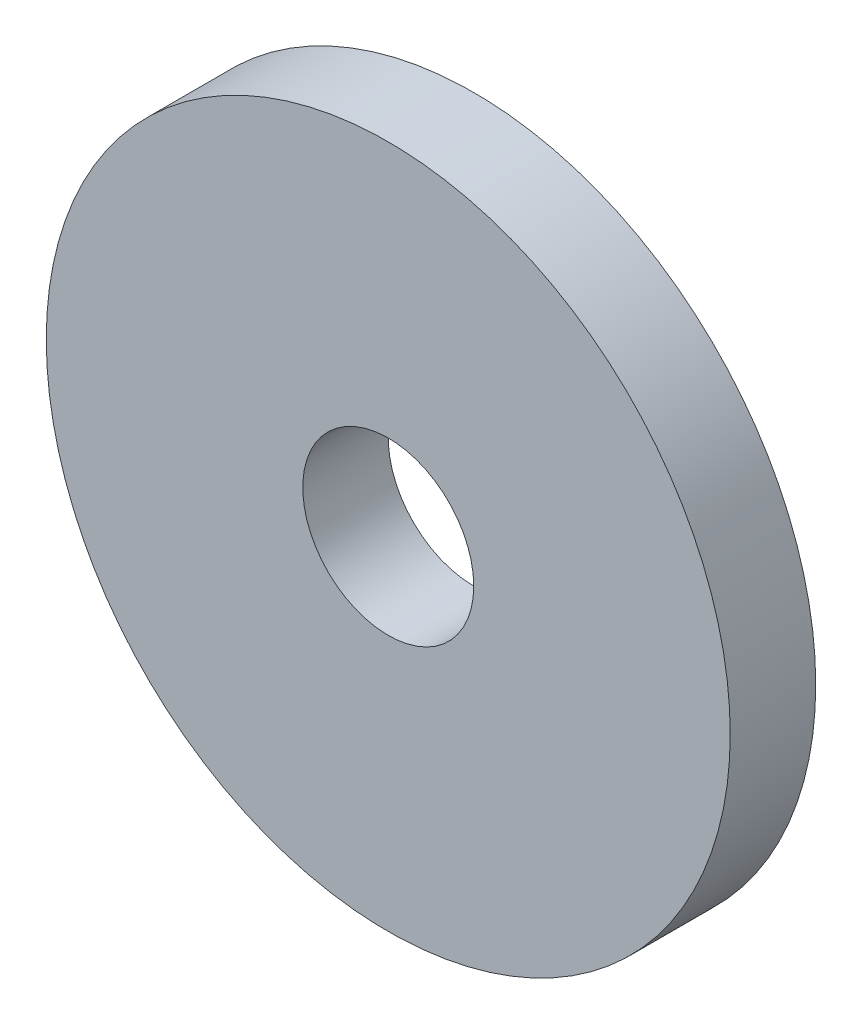
ISO-10303-21;
HEADER;
FILE_DESCRIPTION(('STEP AP214'),'2;1');
FILE_NAME('part.step','',(''),(''),'','','');
FILE_SCHEMA(('AUTOMOTIVE_DESIGN { 1 0 10303 214 1 1 1 1 }'));
ENDSEC;
DATA;
#1=APPLICATION_CONTEXT('core data for automotive mechanical design processes');
#2=APPLICATION_PROTOCOL_DEFINITION('international standard','automotive_design',2000,#1);
#3=PRODUCT_CONTEXT('',#1,'mechanical');
#4=PRODUCT('Part','Part','',(#3));
#5=PRODUCT_RELATED_PRODUCT_CATEGORY('part','',(#4));
#6=PRODUCT_DEFINITION_FORMATION('','',#4);
#7=PRODUCT_DEFINITION_CONTEXT('part definition',#1,'design');
#8=PRODUCT_DEFINITION('design','',#6,#7);
#9=PRODUCT_DEFINITION_SHAPE('','',#8);
#10=(LENGTH_UNIT() NAMED_UNIT(*) SI_UNIT(.MILLI.,.METRE.));
#11=(NAMED_UNIT(*) PLANE_ANGLE_UNIT() SI_UNIT($,.RADIAN.));
#12=(NAMED_UNIT(*) SI_UNIT($,.STERADIAN.) SOLID_ANGLE_UNIT());
#13=UNCERTAINTY_MEASURE_WITH_UNIT(LENGTH_MEASURE(1.E-05),#10,'distance_accuracy_value','');
#14=(GEOMETRIC_REPRESENTATION_CONTEXT(3) GLOBAL_UNCERTAINTY_ASSIGNED_CONTEXT((#13)) GLOBAL_UNIT_ASSIGNED_CONTEXT((#10,
#11,#12)) REPRESENTATION_CONTEXT('',''));
#15=CARTESIAN_POINT('',(0.,0.,0.));
#16=DIRECTION('',(0.,0.,1.));
#17=DIRECTION('',(1.,0.,0.));
#18=AXIS2_PLACEMENT_3D('',#15,#16,#17);
#19=CARTESIAN_POINT('',(0.,0.,1.));
#20=DIRECTION('',(0.,0.,1.));
#21=DIRECTION('',(1.,0.,0.));
#22=AXIS2_PLACEMENT_3D('',#19,#20,#21);
#23=PLANE('',#22);
#24=CARTESIAN_POINT('',(0.,0.,1.));
#25=DIRECTION('',(0.,0.,1.));
#26=DIRECTION('',(1.,0.,0.));
#27=AXIS2_PLACEMENT_3D('',#24,#25,#26);
#28=CIRCLE('',#27,4.);
#29=CARTESIAN_POINT('',(4.,0.,1.));
#30=VERTEX_POINT('',#29);
#31=EDGE_CURVE('E10',#30,#30,#28,.T.);
#32=ORIENTED_EDGE('',*,*,#31,.T.);
#33=EDGE_LOOP('',(#32));
#34=FACE_BOUND('',#33,.T.);
#35=CARTESIAN_POINT('',(0.,0.,1.));
#36=DIRECTION('',(0.,0.,1.));
#37=DIRECTION('',(1.,0.,0.));
#38=AXIS2_PLACEMENT_3D('',#35,#36,#37);
#39=CIRCLE('',#38,1.);
#40=CARTESIAN_POINT('',(1.,0.,1.));
#41=VERTEX_POINT('',#40);
#42=EDGE_CURVE('E52',#41,#41,#39,.T.);
#43=ORIENTED_EDGE('',*,*,#42,.F.);
#44=EDGE_LOOP('',(#43));
#45=FACE_BOUND('',#44,.T.);
#46=ADVANCED_FACE('F41',(#34,#45),#23,.T.);
#47=CARTESIAN_POINT('',(0.,0.,0.));
#48=DIRECTION('',(0.,0.,1.));
#49=DIRECTION('',(1.,0.,0.));
#50=AXIS2_PLACEMENT_3D('',#47,#48,#49);
#51=PLANE('',#50);
#52=CARTESIAN_POINT('',(0.,0.,0.));
#53=DIRECTION('',(0.,0.,1.));
#54=DIRECTION('',(1.,0.,0.));
#55=AXIS2_PLACEMENT_3D('',#52,#53,#54);
#56=CIRCLE('',#55,4.);
#57=CARTESIAN_POINT('',(4.,0.,0.));
#58=VERTEX_POINT('',#57);
#59=EDGE_CURVE('E45',#58,#58,#56,.T.);
#60=ORIENTED_EDGE('',*,*,#59,.F.);
#61=EDGE_LOOP('',(#60));
#62=FACE_BOUND('',#61,.T.);
#63=CARTESIAN_POINT('',(0.,0.,0.));
#64=DIRECTION('',(0.,0.,1.));
#65=DIRECTION('',(1.,0.,0.));
#66=AXIS2_PLACEMENT_3D('',#63,#64,#65);
#67=CIRCLE('',#66,1.);
#68=CARTESIAN_POINT('',(1.,0.,0.));
#69=VERTEX_POINT('',#68);
#70=EDGE_CURVE('E54',#69,#69,#67,.T.);
#71=ORIENTED_EDGE('',*,*,#70,.T.);
#72=EDGE_LOOP('',(#71));
#73=FACE_BOUND('',#72,.T.);
#74=ADVANCED_FACE('F64',(#62,#73),#51,.F.);
#75=CARTESIAN_POINT('',(0.,0.,1.));
#76=DIRECTION('',(0.,0.,-1.));
#77=DIRECTION('',(-1.,0.,0.));
#78=AXIS2_PLACEMENT_3D('',#75,#76,#77);
#79=CYLINDRICAL_SURFACE('',#78,4.);
#80=ORIENTED_EDGE('',*,*,#31,.F.);
#81=EDGE_LOOP('',(#80));
#82=FACE_BOUND('',#81,.T.);
#83=ORIENTED_EDGE('',*,*,#59,.T.);
#84=EDGE_LOOP('',(#83));
#85=FACE_BOUND('',#84,.T.);
#86=ADVANCED_FACE('F43',(#82,#85),#79,.T.);
#87=CARTESIAN_POINT('',(0.,0.,1.));
#88=DIRECTION('',(0.,0.,-1.));
#89=DIRECTION('',(-1.,0.,0.));
#90=AXIS2_PLACEMENT_3D('',#87,#88,#89);
#91=CYLINDRICAL_SURFACE('',#90,1.);
#92=ORIENTED_EDGE('',*,*,#42,.T.);
#93=EDGE_LOOP('',(#92));
#94=FACE_BOUND('',#93,.T.);
#95=ORIENTED_EDGE('',*,*,#70,.F.);
#96=EDGE_LOOP('',(#95));
#97=FACE_BOUND('',#96,.T.);
#98=ADVANCED_FACE('F60',(#94,#97),#91,.F.);
#99=CLOSED_SHELL('',(#46,#74,#86,#98));
#100=MANIFOLD_SOLID_BREP('B2',#99);
#101=ADVANCED_BREP_SHAPE_REPRESENTATION('',(#18,#100),#14);
#102=SHAPE_DEFINITION_REPRESENTATION(#9,#101);
ENDSEC;
END-ISO-10303-21;
